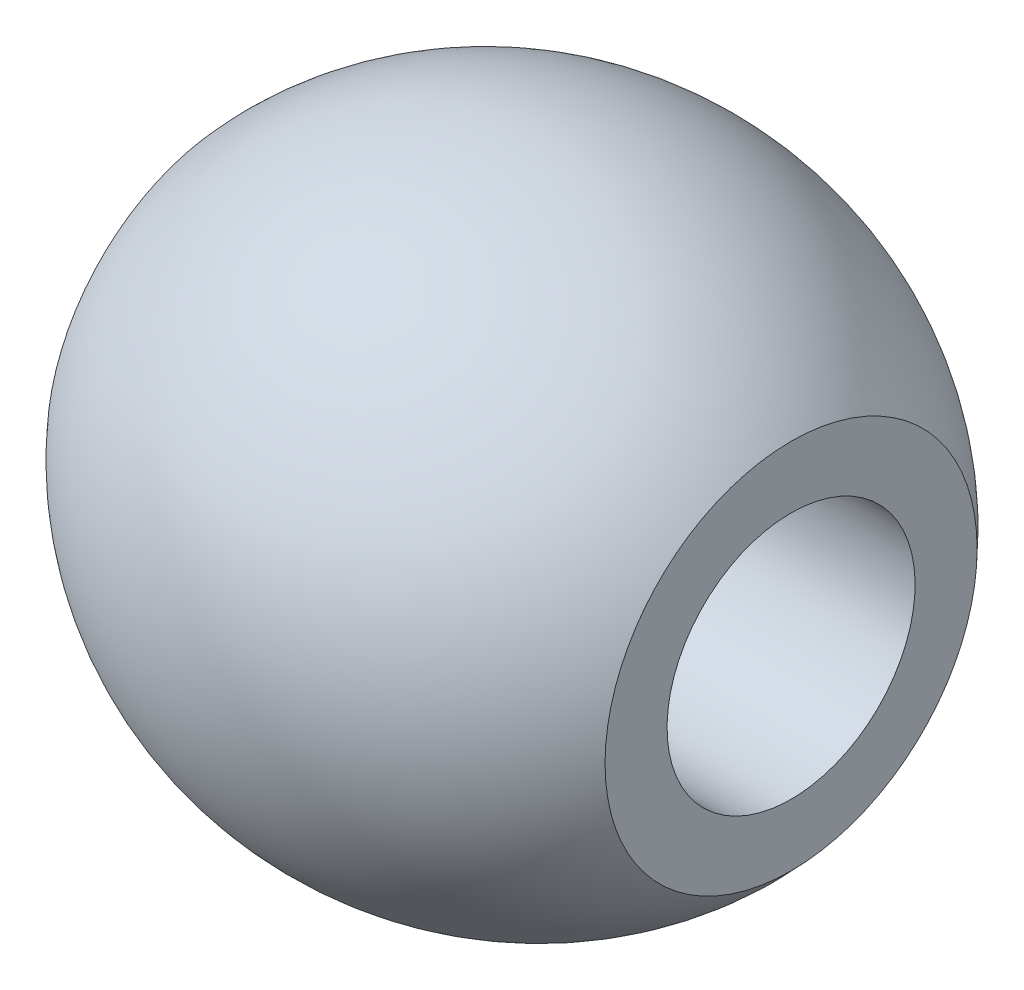
ISO-10303-21;
HEADER;
FILE_DESCRIPTION(('STEP AP214'),'2;1');
FILE_NAME('part.step','',(''),(''),'','','');
FILE_SCHEMA(('AUTOMOTIVE_DESIGN { 1 0 10303 214 1 1 1 1 }'));
ENDSEC;
DATA;
#1=APPLICATION_CONTEXT('core data for automotive mechanical design processes');
#2=APPLICATION_PROTOCOL_DEFINITION('international standard','automotive_design',2000,#1);
#3=PRODUCT_CONTEXT('',#1,'mechanical');
#4=PRODUCT('Part','Part','',(#3));
#5=PRODUCT_RELATED_PRODUCT_CATEGORY('part','',(#4));
#6=PRODUCT_DEFINITION_FORMATION('','',#4);
#7=PRODUCT_DEFINITION_CONTEXT('part definition',#1,'design');
#8=PRODUCT_DEFINITION('design','',#6,#7);
#9=PRODUCT_DEFINITION_SHAPE('','',#8);
#10=(LENGTH_UNIT() NAMED_UNIT(*) SI_UNIT(.MILLI.,.METRE.));
#11=(NAMED_UNIT(*) PLANE_ANGLE_UNIT() SI_UNIT($,.RADIAN.));
#12=(NAMED_UNIT(*) SI_UNIT($,.STERADIAN.) SOLID_ANGLE_UNIT());
#13=UNCERTAINTY_MEASURE_WITH_UNIT(LENGTH_MEASURE(1.E-05),#10,'distance_accuracy_value','');
#14=(GEOMETRIC_REPRESENTATION_CONTEXT(3) GLOBAL_UNCERTAINTY_ASSIGNED_CONTEXT((#13)) GLOBAL_UNIT_ASSIGNED_CONTEXT((#10,
#11,#12)) REPRESENTATION_CONTEXT('',''));
#15=CARTESIAN_POINT('',(0.,0.,0.));
#16=DIRECTION('',(0.,0.,1.));
#17=DIRECTION('',(1.,0.,0.));
#18=AXIS2_PLACEMENT_3D('',#15,#16,#17);
#19=CARTESIAN_POINT('',(-0.5,0.,0.));
#20=DIRECTION('',(-1.,0.,0.));
#21=DIRECTION('',(0.,-1.,0.));
#22=AXIS2_PLACEMENT_3D('',#19,#20,#21);
#23=DEGENERATE_TOROIDAL_SURFACE('',#22,0.968626966596891,5.99999999999825,.F.);
#24=CARTESIAN_POINT('',(-4.99999999999836,0.,0.));
#25=DIRECTION('',(1.,0.,0.));
#26=DIRECTION('',(0.,1.,0.));
#27=AXIS2_PLACEMENT_3D('',#24,#25,#26);
#28=CIRCLE('',#27,2.99999999999855);
#29=CARTESIAN_POINT('',(-4.99999999999836,2.99999999999855,0.));
#30=VERTEX_POINT('',#29);
#31=EDGE_CURVE('E36',#30,#30,#28,.T.);
#32=ORIENTED_EDGE('',*,*,#31,.T.);
#33=EDGE_LOOP('',(#32));
#34=FACE_BOUND('',#33,.T.);
#35=CARTESIAN_POINT('',(3.99999999999534,0.,0.));
#36=DIRECTION('',(-1.,0.,0.));
#37=DIRECTION('',(0.,-1.,0.));
#38=AXIS2_PLACEMENT_3D('',#35,#36,#37);
#39=CIRCLE('',#38,2.99999999999999);
#40=CARTESIAN_POINT('',(3.99999999999534,-2.99999999999999,0.));
#41=VERTEX_POINT('',#40);
#42=EDGE_CURVE('E10',#41,#41,#39,.T.);
#43=ORIENTED_EDGE('',*,*,#42,.T.);
#44=EDGE_LOOP('',(#43));
#45=FACE_BOUND('',#44,.T.);
#46=ADVANCED_FACE('F30',(#34,#45),#23,.F.);
#47=CARTESIAN_POINT('',(3.99999999999767,3.,0.));
#48=DIRECTION('',(-1.,0.,0.));
#49=DIRECTION('',(0.,-1.,0.));
#50=AXIS2_PLACEMENT_3D('',#47,#48,#49);
#51=PLANE('',#50);
#52=CARTESIAN_POINT('',(3.99999999999301,0.,0.));
#53=DIRECTION('',(1.,0.,0.));
#54=DIRECTION('',(0.,1.,0.));
#55=AXIS2_PLACEMENT_3D('',#52,#53,#54);
#56=CIRCLE('',#55,2.);
#57=CARTESIAN_POINT('',(3.99999999999301,2.,0.));
#58=VERTEX_POINT('',#57);
#59=EDGE_CURVE('E44',#58,#58,#56,.T.);
#60=ORIENTED_EDGE('',*,*,#59,.F.);
#61=EDGE_LOOP('',(#60));
#62=FACE_BOUND('',#61,.T.);
#63=ORIENTED_EDGE('',*,*,#42,.F.);
#64=EDGE_LOOP('',(#63));
#65=FACE_BOUND('',#64,.T.);
#66=ADVANCED_FACE('F52',(#62,#65),#51,.F.);
#67=CARTESIAN_POINT('',(-3.99999999998106,0.,0.));
#68=DIRECTION('',(-1.,0.,0.));
#69=DIRECTION('',(0.,-1.,0.));
#70=AXIS2_PLACEMENT_3D('',#67,#68,#69);
#71=CONICAL_SURFACE('',#70,2.,0.785398163388073);
#72=ORIENTED_EDGE('',*,*,#31,.F.);
#73=EDGE_LOOP('',(#72));
#74=FACE_BOUND('',#73,.T.);
#75=CARTESIAN_POINT('',(-3.99999999998106,0.,0.));
#76=DIRECTION('',(1.,0.,0.));
#77=DIRECTION('',(0.,1.,0.));
#78=AXIS2_PLACEMENT_3D('',#75,#76,#77);
#79=CIRCLE('',#78,2.);
#80=CARTESIAN_POINT('',(-3.99999999998106,2.,0.));
#81=VERTEX_POINT('',#80);
#82=EDGE_CURVE('E40',#81,#81,#79,.T.);
#83=ORIENTED_EDGE('',*,*,#82,.T.);
#84=EDGE_LOOP('',(#83));
#85=FACE_BOUND('',#84,.T.);
#86=ADVANCED_FACE('F55',(#74,#85),#71,.F.);
#87=CARTESIAN_POINT('',(3.99999999999534,0.,0.));
#88=DIRECTION('',(1.,0.,0.));
#89=DIRECTION('',(0.,1.,0.));
#90=AXIS2_PLACEMENT_3D('',#87,#88,#89);
#91=CYLINDRICAL_SURFACE('',#90,2.);
#92=ORIENTED_EDGE('',*,*,#82,.F.);
#93=EDGE_LOOP('',(#92));
#94=FACE_BOUND('',#93,.T.);
#95=ORIENTED_EDGE('',*,*,#59,.T.);
#96=EDGE_LOOP('',(#95));
#97=FACE_BOUND('',#96,.T.);
#98=ADVANCED_FACE('F50',(#94,#97),#91,.F.);
#99=CLOSED_SHELL('',(#46,#66,#86,#98));
#100=MANIFOLD_SOLID_BREP('B2',#99);
#101=ADVANCED_BREP_SHAPE_REPRESENTATION('',(#18,#100),#14);
#102=SHAPE_DEFINITION_REPRESENTATION(#9,#101);
ENDSEC;
END-ISO-10303-21;
